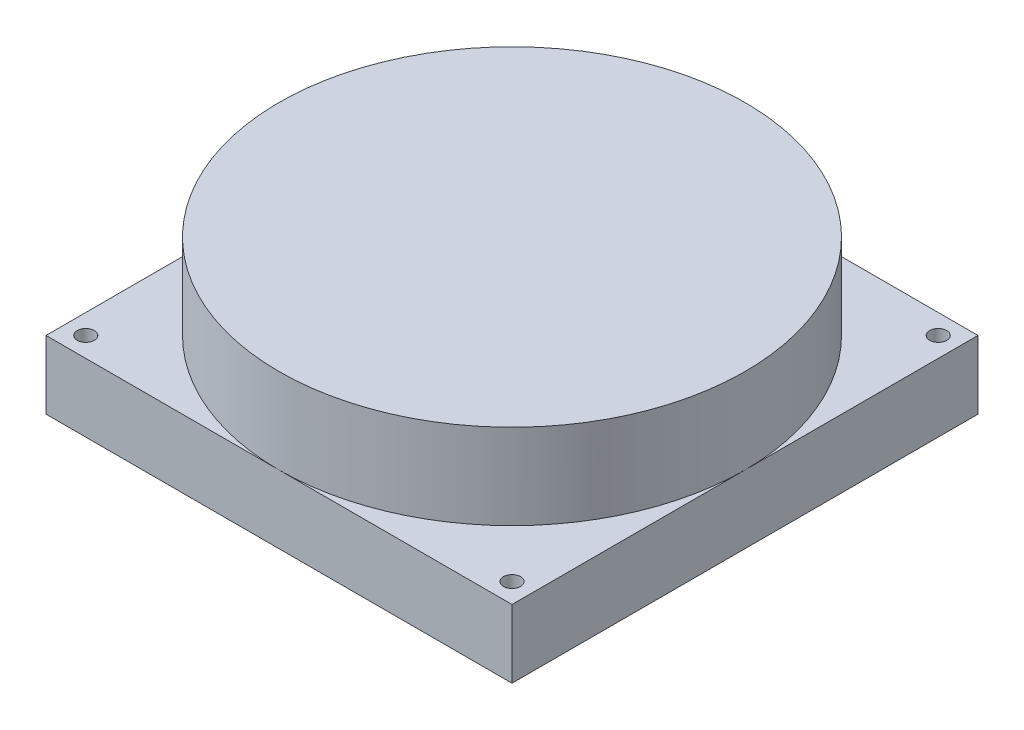
ISO-10303-21;
HEADER;
FILE_DESCRIPTION(('STEP AP214'),'2;1');
FILE_NAME('part.step','',(''),(''),'','','');
FILE_SCHEMA(('AUTOMOTIVE_DESIGN { 1 0 10303 214 1 1 1 1 }'));
ENDSEC;
DATA;
#1=APPLICATION_CONTEXT('core data for automotive mechanical design processes');
#2=APPLICATION_PROTOCOL_DEFINITION('international standard','automotive_design',2000,#1);
#3=PRODUCT_CONTEXT('',#1,'mechanical');
#4=PRODUCT('Part','Part','',(#3));
#5=PRODUCT_RELATED_PRODUCT_CATEGORY('part','',(#4));
#6=PRODUCT_DEFINITION_FORMATION('','',#4);
#7=PRODUCT_DEFINITION_CONTEXT('part definition',#1,'design');
#8=PRODUCT_DEFINITION('design','',#6,#7);
#9=PRODUCT_DEFINITION_SHAPE('','',#8);
#10=(LENGTH_UNIT() NAMED_UNIT(*) SI_UNIT(.MILLI.,.METRE.));
#11=(NAMED_UNIT(*) PLANE_ANGLE_UNIT() SI_UNIT($,.RADIAN.));
#12=(NAMED_UNIT(*) SI_UNIT($,.STERADIAN.) SOLID_ANGLE_UNIT());
#13=UNCERTAINTY_MEASURE_WITH_UNIT(LENGTH_MEASURE(1.E-05),#10,'distance_accuracy_value','');
#14=(GEOMETRIC_REPRESENTATION_CONTEXT(3) GLOBAL_UNCERTAINTY_ASSIGNED_CONTEXT((#13)) GLOBAL_UNIT_ASSIGNED_CONTEXT((#10,
#11,#12)) REPRESENTATION_CONTEXT('',''));
#15=CARTESIAN_POINT('',(0.,0.,0.));
#16=DIRECTION('',(0.,0.,1.));
#17=DIRECTION('',(1.,0.,0.));
#18=AXIS2_PLACEMENT_3D('',#15,#16,#17);
#19=CARTESIAN_POINT('',(0.,12.,0.));
#20=DIRECTION('',(0.,1.,0.));
#21=DIRECTION('',(0.,0.,1.));
#22=AXIS2_PLACEMENT_3D('',#19,#20,#21);
#23=PLANE('',#22);
#24=CARTESIAN_POINT('',(-48.046875,12.,14.6276041666667));
#25=DIRECTION('',(0.,1.,0.));
#26=DIRECTION('',(0.,0.,1.));
#27=AXIS2_PLACEMENT_3D('',#24,#25,#26);
#28=CIRCLE('',#27,41.);
#29=CARTESIAN_POINT('',(-48.046875,12.,55.6276041666667));
#30=VERTEX_POINT('',#29);
#31=CARTESIAN_POINT('',(-7.04687499999999,12.,14.6276041666667));
#32=VERTEX_POINT('',#31);
#33=EDGE_CURVE('E45',#30,#32,#28,.T.);
#34=ORIENTED_EDGE('',*,*,#33,.F.);
#35=DIRECTION('',(1.,0.,0.));
#36=VECTOR('',#35,1.);
#37=CARTESIAN_POINT('',(-89.046875,12.,55.6276041666667));
#38=LINE('',#37,#36);
#39=CARTESIAN_POINT('',(-7.04687499999999,12.,55.6276041666667));
#40=VERTEX_POINT('',#39);
#41=EDGE_CURVE('E100',#30,#40,#38,.T.);
#42=ORIENTED_EDGE('',*,*,#41,.T.);
#43=DIRECTION('',(0.,0.,-1.));
#44=VECTOR('',#43,1.);
#45=CARTESIAN_POINT('',(-7.04687499999999,12.,-26.3723958333333));
#46=LINE('',#45,#44);
#47=EDGE_CURVE('E113',#40,#32,#46,.T.);
#48=ORIENTED_EDGE('',*,*,#47,.T.);
#49=EDGE_LOOP('',(#34,#42,#48));
#50=FACE_BOUND('',#49,.T.);
#51=CARTESIAN_POINT('',(-10.546875,12.,52.1276041666667));
#52=DIRECTION('',(0.,-1.,0.));
#53=DIRECTION('',(0.,0.,-1.));
#54=AXIS2_PLACEMENT_3D('',#51,#52,#53);
#55=CIRCLE('',#54,1.5);
#56=CARTESIAN_POINT('',(-10.546875,12.,50.6276041666667));
#57=VERTEX_POINT('',#56);
#58=EDGE_CURVE('E128',#57,#57,#55,.T.);
#59=ORIENTED_EDGE('',*,*,#58,.T.);
#60=EDGE_LOOP('',(#59));
#61=FACE_BOUND('',#60,.T.);
#62=ADVANCED_FACE('F34',(#50,#61),#23,.T.);
#63=CARTESIAN_POINT('',(-48.046875,12.,-26.3723958333333));
#64=VERTEX_POINT('',#63);
#65=EDGE_CURVE('E11',#32,#64,#28,.T.);
#66=ORIENTED_EDGE('',*,*,#65,.F.);
#67=CARTESIAN_POINT('',(-7.04687499999999,12.,-26.3723958333333));
#68=VERTEX_POINT('',#67);
#69=EDGE_CURVE('E99',#32,#68,#46,.T.);
#70=ORIENTED_EDGE('',*,*,#69,.T.);
#71=DIRECTION('',(-1.,0.,0.));
#72=VECTOR('',#71,1.);
#73=CARTESIAN_POINT('',(-89.046875,12.,-26.3723958333333));
#74=LINE('',#73,#72);
#75=EDGE_CURVE('E149',#68,#64,#74,.T.);
#76=ORIENTED_EDGE('',*,*,#75,.T.);
#77=EDGE_LOOP('',(#66,#70,#76));
#78=FACE_BOUND('',#77,.T.);
#79=CARTESIAN_POINT('',(-10.546875,12.,-22.8723958333333));
#80=DIRECTION('',(0.,-1.,0.));
#81=DIRECTION('',(0.,0.,-1.));
#82=AXIS2_PLACEMENT_3D('',#79,#80,#81);
#83=CIRCLE('',#82,1.5);
#84=CARTESIAN_POINT('',(-10.546875,12.,-24.3723958333333));
#85=VERTEX_POINT('',#84);
#86=EDGE_CURVE('E121',#85,#85,#83,.T.);
#87=ORIENTED_EDGE('',*,*,#86,.T.);
#88=EDGE_LOOP('',(#87));
#89=FACE_BOUND('',#88,.T.);
#90=ADVANCED_FACE('F180',(#78,#89),#23,.T.);
#91=CARTESIAN_POINT('',(-89.046875,12.,14.6276041666667));
#92=VERTEX_POINT('',#91);
#93=EDGE_CURVE('E43',#64,#92,#28,.T.);
#94=ORIENTED_EDGE('',*,*,#93,.F.);
#95=CARTESIAN_POINT('',(-89.046875,12.,-26.3723958333333));
#96=VERTEX_POINT('',#95);
#97=EDGE_CURVE('E148',#64,#96,#74,.T.);
#98=ORIENTED_EDGE('',*,*,#97,.T.);
#99=DIRECTION('',(0.,0.,1.));
#100=VECTOR('',#99,1.);
#101=CARTESIAN_POINT('',(-89.046875,12.,-26.3723958333333));
#102=LINE('',#101,#100);
#103=EDGE_CURVE('E110',#96,#92,#102,.T.);
#104=ORIENTED_EDGE('',*,*,#103,.T.);
#105=EDGE_LOOP('',(#94,#98,#104));
#106=FACE_BOUND('',#105,.T.);
#107=CARTESIAN_POINT('',(-85.546875,12.,-22.8723958333333));
#108=DIRECTION('',(0.,-1.,0.));
#109=DIRECTION('',(0.,0.,-1.));
#110=AXIS2_PLACEMENT_3D('',#107,#108,#109);
#111=CIRCLE('',#110,1.5);
#112=CARTESIAN_POINT('',(-85.546875,12.,-24.3723958333333));
#113=VERTEX_POINT('',#112);
#114=EDGE_CURVE('E135',#113,#113,#111,.T.);
#115=ORIENTED_EDGE('',*,*,#114,.T.);
#116=EDGE_LOOP('',(#115));
#117=FACE_BOUND('',#116,.T.);
#118=ADVANCED_FACE('F178',(#106,#117),#23,.T.);
#119=CARTESIAN_POINT('',(-89.046875,12.,-26.3723958333333));
#120=DIRECTION('',(1.,0.,0.));
#121=DIRECTION('',(0.,0.,-1.));
#122=AXIS2_PLACEMENT_3D('',#119,#120,#121);
#123=PLANE('',#122);
#124=DIRECTION('',(0.,0.,1.));
#125=VECTOR('',#124,1.);
#126=CARTESIAN_POINT('',(-89.046875,0.,-26.3723958333333));
#127=LINE('',#126,#125);
#128=CARTESIAN_POINT('',(-89.046875,0.,-26.3723958333333));
#129=VERTEX_POINT('',#128);
#130=CARTESIAN_POINT('',(-89.046875,0.,55.6276041666667));
#131=VERTEX_POINT('',#130);
#132=EDGE_CURVE('E143',#129,#131,#127,.T.);
#133=ORIENTED_EDGE('',*,*,#132,.T.);
#134=DIRECTION('',(0.,-1.,0.));
#135=VECTOR('',#134,1.);
#136=CARTESIAN_POINT('',(-89.046875,12.,55.6276041666667));
#137=LINE('',#136,#135);
#138=CARTESIAN_POINT('',(-89.046875,12.,55.6276041666667));
#139=VERTEX_POINT('',#138);
#140=EDGE_CURVE('E38',#139,#131,#137,.T.);
#141=ORIENTED_EDGE('',*,*,#140,.F.);
#142=EDGE_CURVE('E95',#92,#139,#102,.T.);
#143=ORIENTED_EDGE('',*,*,#142,.F.);
#144=ORIENTED_EDGE('',*,*,#103,.F.);
#145=DIRECTION('',(0.,-1.,0.));
#146=VECTOR('',#145,1.);
#147=CARTESIAN_POINT('',(-89.046875,12.,-26.3723958333333));
#148=LINE('',#147,#146);
#149=EDGE_CURVE('E151',#96,#129,#148,.T.);
#150=ORIENTED_EDGE('',*,*,#149,.T.);
#151=EDGE_LOOP('',(#133,#141,#143,#144,#150));
#152=FACE_BOUND('',#151,.T.);
#153=ADVANCED_FACE('F36',(#152),#123,.F.);
#154=CARTESIAN_POINT('',(-89.046875,12.,55.6276041666667));
#155=DIRECTION('',(0.,0.,-1.));
#156=DIRECTION('',(-1.,0.,0.));
#157=AXIS2_PLACEMENT_3D('',#154,#155,#156);
#158=PLANE('',#157);
#159=DIRECTION('',(1.,0.,0.));
#160=VECTOR('',#159,1.);
#161=CARTESIAN_POINT('',(-89.046875,0.,55.6276041666667));
#162=LINE('',#161,#160);
#163=CARTESIAN_POINT('',(-7.04687499999999,0.,55.6276041666667));
#164=VERTEX_POINT('',#163);
#165=EDGE_CURVE('E154',#131,#164,#162,.T.);
#166=ORIENTED_EDGE('',*,*,#165,.T.);
#167=DIRECTION('',(0.,-1.,0.));
#168=VECTOR('',#167,1.);
#169=CARTESIAN_POINT('',(-7.04687499999999,12.,55.6276041666667));
#170=LINE('',#169,#168);
#171=EDGE_CURVE('E106',#40,#164,#170,.T.);
#172=ORIENTED_EDGE('',*,*,#171,.F.);
#173=ORIENTED_EDGE('',*,*,#41,.F.);
#174=EDGE_CURVE('E88',#139,#30,#38,.T.);
#175=ORIENTED_EDGE('',*,*,#174,.F.);
#176=ORIENTED_EDGE('',*,*,#140,.T.);
#177=EDGE_LOOP('',(#166,#172,#173,#175,#176));
#178=FACE_BOUND('',#177,.T.);
#179=ADVANCED_FACE('F104',(#178),#158,.F.);
#180=CARTESIAN_POINT('',(-7.04687499999999,12.,-26.3723958333333));
#181=DIRECTION('',(-1.,0.,0.));
#182=DIRECTION('',(0.,0.,1.));
#183=AXIS2_PLACEMENT_3D('',#180,#181,#182);
#184=PLANE('',#183);
#185=DIRECTION('',(0.,0.,-1.));
#186=VECTOR('',#185,1.);
#187=CARTESIAN_POINT('',(-7.04687499999999,0.,-26.3723958333333));
#188=LINE('',#187,#186);
#189=CARTESIAN_POINT('',(-7.04687499999999,0.,-26.3723958333333));
#190=VERTEX_POINT('',#189);
#191=EDGE_CURVE('E156',#164,#190,#188,.T.);
#192=ORIENTED_EDGE('',*,*,#191,.T.);
#193=DIRECTION('',(0.,-1.,0.));
#194=VECTOR('',#193,1.);
#195=CARTESIAN_POINT('',(-7.04687499999999,12.,-26.3723958333333));
#196=LINE('',#195,#194);
#197=EDGE_CURVE('E162',#68,#190,#196,.T.);
#198=ORIENTED_EDGE('',*,*,#197,.F.);
#199=ORIENTED_EDGE('',*,*,#69,.F.);
#200=ORIENTED_EDGE('',*,*,#47,.F.);
#201=ORIENTED_EDGE('',*,*,#171,.T.);
#202=EDGE_LOOP('',(#192,#198,#199,#200,#201));
#203=FACE_BOUND('',#202,.T.);
#204=ADVANCED_FACE('F166',(#203),#184,.F.);
#205=CARTESIAN_POINT('',(-89.046875,12.,-26.3723958333333));
#206=DIRECTION('',(0.,0.,1.));
#207=DIRECTION('',(1.,0.,0.));
#208=AXIS2_PLACEMENT_3D('',#205,#206,#207);
#209=PLANE('',#208);
#210=DIRECTION('',(-1.,0.,0.));
#211=VECTOR('',#210,1.);
#212=CARTESIAN_POINT('',(-89.046875,0.,-26.3723958333333));
#213=LINE('',#212,#211);
#214=EDGE_CURVE('E158',#190,#129,#213,.T.);
#215=ORIENTED_EDGE('',*,*,#214,.T.);
#216=ORIENTED_EDGE('',*,*,#149,.F.);
#217=ORIENTED_EDGE('',*,*,#97,.F.);
#218=ORIENTED_EDGE('',*,*,#75,.F.);
#219=ORIENTED_EDGE('',*,*,#197,.T.);
#220=EDGE_LOOP('',(#215,#216,#217,#218,#219));
#221=FACE_BOUND('',#220,.T.);
#222=ADVANCED_FACE('F174',(#221),#209,.F.);
#223=EDGE_CURVE('E93',#92,#30,#28,.T.);
#224=ORIENTED_EDGE('',*,*,#223,.F.);
#225=ORIENTED_EDGE('',*,*,#142,.T.);
#226=ORIENTED_EDGE('',*,*,#174,.T.);
#227=EDGE_LOOP('',(#224,#225,#226));
#228=FACE_BOUND('',#227,.T.);
#229=CARTESIAN_POINT('',(-85.546875,12.,52.1276041666667));
#230=DIRECTION('',(0.,-1.,0.));
#231=DIRECTION('',(0.,0.,-1.));
#232=AXIS2_PLACEMENT_3D('',#229,#230,#231);
#233=CIRCLE('',#232,1.5);
#234=CARTESIAN_POINT('',(-85.546875,12.,50.6276041666667));
#235=VERTEX_POINT('',#234);
#236=EDGE_CURVE('E140',#235,#235,#233,.T.);
#237=ORIENTED_EDGE('',*,*,#236,.T.);
#238=EDGE_LOOP('',(#237));
#239=FACE_BOUND('',#238,.T.);
#240=ADVANCED_FACE('F90',(#228,#239),#23,.T.);
#241=CARTESIAN_POINT('',(0.,0.,0.));
#242=DIRECTION('',(0.,1.,0.));
#243=DIRECTION('',(0.,0.,1.));
#244=AXIS2_PLACEMENT_3D('',#241,#242,#243);
#245=PLANE('',#244);
#246=CARTESIAN_POINT('',(-57.046875,0.,14.8776041666667));
#247=DIRECTION('',(0.,-1.,0.));
#248=DIRECTION('',(0.,0.,-1.));
#249=AXIS2_PLACEMENT_3D('',#246,#247,#248);
#250=CIRCLE('',#249,1.5);
#251=CARTESIAN_POINT('',(-57.046875,0.,13.3776041666667));
#252=VERTEX_POINT('',#251);
#253=EDGE_CURVE('E367',#252,#252,#250,.T.);
#254=ORIENTED_EDGE('',*,*,#253,.F.);
#255=EDGE_LOOP('',(#254));
#256=FACE_BOUND('',#255,.T.);
#257=CARTESIAN_POINT('',(-39.046875,0.,14.8776041666667));
#258=DIRECTION('',(0.,-1.,0.));
#259=DIRECTION('',(0.,0.,-1.));
#260=AXIS2_PLACEMENT_3D('',#257,#258,#259);
#261=CIRCLE('',#260,1.5);
#262=CARTESIAN_POINT('',(-39.046875,0.,13.3776041666667));
#263=VERTEX_POINT('',#262);
#264=EDGE_CURVE('E374',#263,#263,#261,.T.);
#265=ORIENTED_EDGE('',*,*,#264,.F.);
#266=EDGE_LOOP('',(#265));
#267=FACE_BOUND('',#266,.T.);
#268=CARTESIAN_POINT('',(-10.546875,0.,52.1276041666667));
#269=DIRECTION('',(0.,-1.,0.));
#270=DIRECTION('',(0.,0.,-1.));
#271=AXIS2_PLACEMENT_3D('',#268,#269,#270);
#272=CIRCLE('',#271,1.5);
#273=CARTESIAN_POINT('',(-10.546875,0.,50.6276041666667));
#274=VERTEX_POINT('',#273);
#275=EDGE_CURVE('E132',#274,#274,#272,.T.);
#276=ORIENTED_EDGE('',*,*,#275,.F.);
#277=EDGE_LOOP('',(#276));
#278=FACE_BOUND('',#277,.T.);
#279=CARTESIAN_POINT('',(-85.546875,0.,-22.8723958333333));
#280=DIRECTION('',(0.,-1.,0.));
#281=DIRECTION('',(0.,0.,-1.));
#282=AXIS2_PLACEMENT_3D('',#279,#280,#281);
#283=CIRCLE('',#282,1.5);
#284=CARTESIAN_POINT('',(-85.546875,0.,-24.3723958333333));
#285=VERTEX_POINT('',#284);
#286=EDGE_CURVE('E124',#285,#285,#283,.T.);
#287=ORIENTED_EDGE('',*,*,#286,.F.);
#288=EDGE_LOOP('',(#287));
#289=FACE_BOUND('',#288,.T.);
#290=CARTESIAN_POINT('',(-10.546875,0.,-22.8723958333333));
#291=DIRECTION('',(0.,-1.,0.));
#292=DIRECTION('',(0.,0.,-1.));
#293=AXIS2_PLACEMENT_3D('',#290,#291,#292);
#294=CIRCLE('',#293,1.5);
#295=CARTESIAN_POINT('',(-10.546875,0.,-24.3723958333333));
#296=VERTEX_POINT('',#295);
#297=EDGE_CURVE('E125',#296,#296,#294,.T.);
#298=ORIENTED_EDGE('',*,*,#297,.F.);
#299=EDGE_LOOP('',(#298));
#300=FACE_BOUND('',#299,.T.);
#301=CARTESIAN_POINT('',(-85.546875,0.,52.1276041666667));
#302=DIRECTION('',(0.,-1.,0.));
#303=DIRECTION('',(0.,0.,-1.));
#304=AXIS2_PLACEMENT_3D('',#301,#302,#303);
#305=CIRCLE('',#304,1.5);
#306=CARTESIAN_POINT('',(-85.546875,0.,50.6276041666667));
#307=VERTEX_POINT('',#306);
#308=EDGE_CURVE('E131',#307,#307,#305,.T.);
#309=ORIENTED_EDGE('',*,*,#308,.F.);
#310=EDGE_LOOP('',(#309));
#311=FACE_BOUND('',#310,.T.);
#312=ORIENTED_EDGE('',*,*,#132,.F.);
#313=ORIENTED_EDGE('',*,*,#214,.F.);
#314=ORIENTED_EDGE('',*,*,#191,.F.);
#315=ORIENTED_EDGE('',*,*,#165,.F.);
#316=EDGE_LOOP('',(#312,#313,#314,#315));
#317=FACE_BOUND('',#316,.T.);
#318=ADVANCED_FACE('F171',(#256,#267,#278,#289,#300,#311,#317),#245,.F.);
#319=CARTESIAN_POINT('',(-85.546875,12.,52.1276041666667));
#320=DIRECTION('',(0.,-1.,0.));
#321=DIRECTION('',(0.,0.,-1.));
#322=AXIS2_PLACEMENT_3D('',#319,#320,#321);
#323=CYLINDRICAL_SURFACE('',#322,1.5);
#324=ORIENTED_EDGE('',*,*,#236,.F.);
#325=EDGE_LOOP('',(#324));
#326=FACE_BOUND('',#325,.T.);
#327=ORIENTED_EDGE('',*,*,#308,.T.);
#328=EDGE_LOOP('',(#327));
#329=FACE_BOUND('',#328,.T.);
#330=ADVANCED_FACE('F190',(#326,#329),#323,.F.);
#331=CARTESIAN_POINT('',(-10.546875,12.,-22.8723958333333));
#332=DIRECTION('',(0.,-1.,0.));
#333=DIRECTION('',(0.,0.,-1.));
#334=AXIS2_PLACEMENT_3D('',#331,#332,#333);
#335=CYLINDRICAL_SURFACE('',#334,1.5);
#336=ORIENTED_EDGE('',*,*,#86,.F.);
#337=EDGE_LOOP('',(#336));
#338=FACE_BOUND('',#337,.T.);
#339=ORIENTED_EDGE('',*,*,#297,.T.);
#340=EDGE_LOOP('',(#339));
#341=FACE_BOUND('',#340,.T.);
#342=ADVANCED_FACE('F186',(#338,#341),#335,.F.);
#343=CARTESIAN_POINT('',(-85.546875,12.,-22.8723958333333));
#344=DIRECTION('',(0.,-1.,0.));
#345=DIRECTION('',(0.,0.,-1.));
#346=AXIS2_PLACEMENT_3D('',#343,#344,#345);
#347=CYLINDRICAL_SURFACE('',#346,1.5);
#348=ORIENTED_EDGE('',*,*,#114,.F.);
#349=EDGE_LOOP('',(#348));
#350=FACE_BOUND('',#349,.T.);
#351=ORIENTED_EDGE('',*,*,#286,.T.);
#352=EDGE_LOOP('',(#351));
#353=FACE_BOUND('',#352,.T.);
#354=ADVANCED_FACE('F189',(#350,#353),#347,.F.);
#355=CARTESIAN_POINT('',(-10.546875,12.,52.1276041666667));
#356=DIRECTION('',(0.,-1.,0.));
#357=DIRECTION('',(0.,0.,-1.));
#358=AXIS2_PLACEMENT_3D('',#355,#356,#357);
#359=CYLINDRICAL_SURFACE('',#358,1.5);
#360=ORIENTED_EDGE('',*,*,#58,.F.);
#361=EDGE_LOOP('',(#360));
#362=FACE_BOUND('',#361,.T.);
#363=ORIENTED_EDGE('',*,*,#275,.T.);
#364=EDGE_LOOP('',(#363));
#365=FACE_BOUND('',#364,.T.);
#366=ADVANCED_FACE('F247',(#362,#365),#359,.F.);
#367=CARTESIAN_POINT('',(-48.046875,27.,14.6276041666667));
#368=DIRECTION('',(0.,-1.,0.));
#369=DIRECTION('',(0.,0.,-1.));
#370=AXIS2_PLACEMENT_3D('',#367,#368,#369);
#371=CYLINDRICAL_SURFACE('',#370,41.);
#372=CARTESIAN_POINT('',(-48.046875,27.,14.6276041666667));
#373=DIRECTION('',(0.,1.,0.));
#374=DIRECTION('',(0.,0.,1.));
#375=AXIS2_PLACEMENT_3D('',#372,#373,#374);
#376=CIRCLE('',#375,41.);
#377=CARTESIAN_POINT('',(-48.046875,27.,55.6276041666667));
#378=VERTEX_POINT('',#377);
#379=EDGE_CURVE('E115',#378,#378,#376,.T.);
#380=ORIENTED_EDGE('',*,*,#379,.F.);
#381=EDGE_LOOP('',(#380));
#382=FACE_BOUND('',#381,.T.);
#383=ORIENTED_EDGE('',*,*,#33,.T.);
#384=ORIENTED_EDGE('',*,*,#65,.T.);
#385=ORIENTED_EDGE('',*,*,#93,.T.);
#386=ORIENTED_EDGE('',*,*,#223,.T.);
#387=EDGE_LOOP('',(#383,#384,#385,#386));
#388=FACE_BOUND('',#387,.T.);
#389=ADVANCED_FACE('F117',(#382,#388),#371,.T.);
#390=CARTESIAN_POINT('',(-48.046875,27.,14.6276041666667));
#391=DIRECTION('',(0.,1.,0.));
#392=DIRECTION('',(0.,0.,1.));
#393=AXIS2_PLACEMENT_3D('',#390,#391,#392);
#394=PLANE('',#393);
#395=ORIENTED_EDGE('',*,*,#379,.T.);
#396=EDGE_LOOP('',(#395));
#397=FACE_BOUND('',#396,.T.);
#398=ADVANCED_FACE('F246',(#397),#394,.T.);
#399=CARTESIAN_POINT('',(-39.046875,5.,14.8776041666667));
#400=DIRECTION('',(0.,-1.,0.));
#401=DIRECTION('',(0.,0.,-1.));
#402=AXIS2_PLACEMENT_3D('',#399,#400,#401);
#403=CYLINDRICAL_SURFACE('',#402,1.5);
#404=CARTESIAN_POINT('',(-39.046875,5.,14.8776041666667));
#405=DIRECTION('',(0.,-1.,0.));
#406=DIRECTION('',(0.,0.,-1.));
#407=AXIS2_PLACEMENT_3D('',#404,#405,#406);
#408=CIRCLE('',#407,1.5);
#409=CARTESIAN_POINT('',(-39.046875,5.,13.3776041666667));
#410=VERTEX_POINT('',#409);
#411=EDGE_CURVE('E370',#410,#410,#408,.T.);
#412=ORIENTED_EDGE('',*,*,#411,.F.);
#413=EDGE_LOOP('',(#412));
#414=FACE_BOUND('',#413,.T.);
#415=ORIENTED_EDGE('',*,*,#264,.T.);
#416=EDGE_LOOP('',(#415));
#417=FACE_BOUND('',#416,.T.);
#418=ADVANCED_FACE('F259',(#414,#417),#403,.F.);
#419=CARTESIAN_POINT('',(-39.046875,5.,14.8776041666667));
#420=DIRECTION('',(0.,-1.,0.));
#421=DIRECTION('',(0.,0.,-1.));
#422=AXIS2_PLACEMENT_3D('',#419,#420,#421);
#423=PLANE('',#422);
#424=ORIENTED_EDGE('',*,*,#411,.T.);
#425=EDGE_LOOP('',(#424));
#426=FACE_BOUND('',#425,.T.);
#427=ADVANCED_FACE('F275',(#426),#423,.T.);
#428=CARTESIAN_POINT('',(-57.046875,5.,14.8776041666667));
#429=DIRECTION('',(0.,-1.,0.));
#430=DIRECTION('',(0.,0.,-1.));
#431=AXIS2_PLACEMENT_3D('',#428,#429,#430);
#432=CYLINDRICAL_SURFACE('',#431,1.5);
#433=CARTESIAN_POINT('',(-57.046875,5.,14.8776041666667));
#434=DIRECTION('',(0.,-1.,0.));
#435=DIRECTION('',(0.,0.,-1.));
#436=AXIS2_PLACEMENT_3D('',#433,#434,#435);
#437=CIRCLE('',#436,1.5);
#438=CARTESIAN_POINT('',(-57.046875,5.,13.3776041666667));
#439=VERTEX_POINT('',#438);
#440=EDGE_CURVE('E116',#439,#439,#437,.T.);
#441=ORIENTED_EDGE('',*,*,#440,.F.);
#442=EDGE_LOOP('',(#441));
#443=FACE_BOUND('',#442,.T.);
#444=ORIENTED_EDGE('',*,*,#253,.T.);
#445=EDGE_LOOP('',(#444));
#446=FACE_BOUND('',#445,.T.);
#447=ADVANCED_FACE('F285',(#443,#446),#432,.F.);
#448=CARTESIAN_POINT('',(-57.046875,5.,14.8776041666667));
#449=DIRECTION('',(0.,-1.,0.));
#450=DIRECTION('',(0.,0.,-1.));
#451=AXIS2_PLACEMENT_3D('',#448,#449,#450);
#452=PLANE('',#451);
#453=ORIENTED_EDGE('',*,*,#440,.T.);
#454=EDGE_LOOP('',(#453));
#455=FACE_BOUND('',#454,.T.);
#456=ADVANCED_FACE('F295',(#455),#452,.T.);
#457=CLOSED_SHELL('',(#62,#90,#118,#153,#179,#204,#222,#240,#318,#330,#342,#354,#366,#389,#398,
#418,#427,#447,#456));
#458=MANIFOLD_SOLID_BREP('B2',#457);
#459=ADVANCED_BREP_SHAPE_REPRESENTATION('',(#18,#458),#14);
#460=SHAPE_DEFINITION_REPRESENTATION(#9,#459);
ENDSEC;
END-ISO-10303-21;
